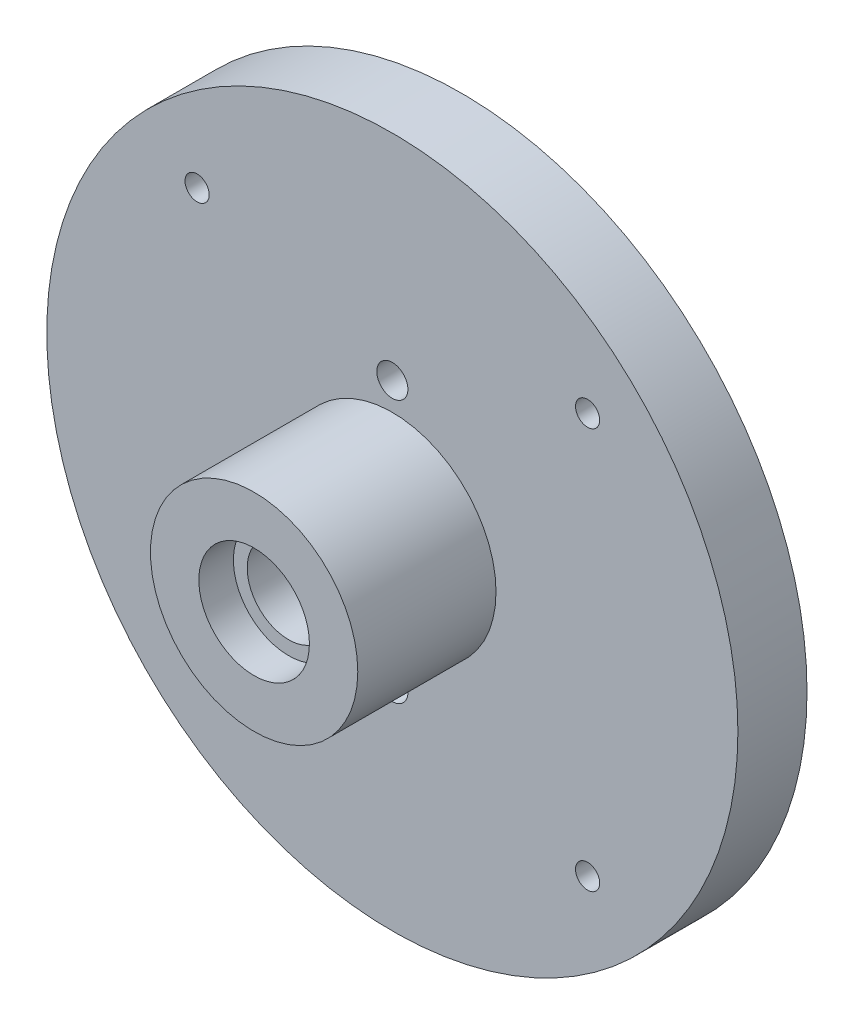
ISO-10303-21;
HEADER;
FILE_DESCRIPTION(('STEP AP214'),'2;1');
FILE_NAME('part.step','',(''),(''),'','','');
FILE_SCHEMA(('AUTOMOTIVE_DESIGN { 1 0 10303 214 1 1 1 1 }'));
ENDSEC;
DATA;
#1=APPLICATION_CONTEXT('core data for automotive mechanical design processes');
#2=APPLICATION_PROTOCOL_DEFINITION('international standard','automotive_design',2000,#1);
#3=PRODUCT_CONTEXT('',#1,'mechanical');
#4=PRODUCT('Part','Part','',(#3));
#5=PRODUCT_RELATED_PRODUCT_CATEGORY('part','',(#4));
#6=PRODUCT_DEFINITION_FORMATION('','',#4);
#7=PRODUCT_DEFINITION_CONTEXT('part definition',#1,'design');
#8=PRODUCT_DEFINITION('design','',#6,#7);
#9=PRODUCT_DEFINITION_SHAPE('','',#8);
#10=(LENGTH_UNIT() NAMED_UNIT(*) SI_UNIT(.MILLI.,.METRE.));
#11=(NAMED_UNIT(*) PLANE_ANGLE_UNIT() SI_UNIT($,.RADIAN.));
#12=(NAMED_UNIT(*) SI_UNIT($,.STERADIAN.) SOLID_ANGLE_UNIT());
#13=UNCERTAINTY_MEASURE_WITH_UNIT(LENGTH_MEASURE(1.E-05),#10,'distance_accuracy_value','');
#14=(GEOMETRIC_REPRESENTATION_CONTEXT(3) GLOBAL_UNCERTAINTY_ASSIGNED_CONTEXT((#13)) GLOBAL_UNIT_ASSIGNED_CONTEXT((#10,
#11,#12)) REPRESENTATION_CONTEXT('',''));
#15=CARTESIAN_POINT('',(0.,0.,0.));
#16=DIRECTION('',(0.,0.,1.));
#17=DIRECTION('',(1.,0.,0.));
#18=AXIS2_PLACEMENT_3D('',#15,#16,#17);
#19=CARTESIAN_POINT('',(0.,0.,10.));
#20=DIRECTION('',(0.,0.,1.));
#21=DIRECTION('',(1.,0.,0.));
#22=AXIS2_PLACEMENT_3D('',#19,#20,#21);
#23=PLANE('',#22);
#24=CARTESIAN_POINT('',(0.,-19.,10.));
#25=DIRECTION('',(0.,0.,1.));
#26=DIRECTION('',(1.,0.,0.));
#27=AXIS2_PLACEMENT_3D('',#24,#25,#26);
#28=CIRCLE('',#27,2.25);
#29=CARTESIAN_POINT('',(2.25,-19.,10.));
#30=VERTEX_POINT('',#29);
#31=EDGE_CURVE('E90',#30,#30,#28,.T.);
#32=ORIENTED_EDGE('',*,*,#31,.F.);
#33=EDGE_LOOP('',(#32));
#34=FACE_BOUND('',#33,.T.);
#35=CARTESIAN_POINT('',(0.,19.,10.));
#36=DIRECTION('',(0.,0.,1.));
#37=DIRECTION('',(1.,0.,0.));
#38=AXIS2_PLACEMENT_3D('',#35,#36,#37);
#39=CIRCLE('',#38,2.25);
#40=CARTESIAN_POINT('',(2.25,19.,10.));
#41=VERTEX_POINT('',#40);
#42=EDGE_CURVE('E84',#41,#41,#39,.T.);
#43=ORIENTED_EDGE('',*,*,#42,.F.);
#44=EDGE_LOOP('',(#43));
#45=FACE_BOUND('',#44,.T.);
#46=CARTESIAN_POINT('',(28.25,-29.,10.));
#47=DIRECTION('',(0.,0.,1.));
#48=DIRECTION('',(1.,0.,0.));
#49=AXIS2_PLACEMENT_3D('',#46,#47,#48);
#50=CIRCLE('',#49,1.75);
#51=CARTESIAN_POINT('',(30.,-29.,10.));
#52=VERTEX_POINT('',#51);
#53=EDGE_CURVE('E78',#52,#52,#50,.T.);
#54=ORIENTED_EDGE('',*,*,#53,.F.);
#55=EDGE_LOOP('',(#54));
#56=FACE_BOUND('',#55,.T.);
#57=CARTESIAN_POINT('',(-28.25,-29.,10.));
#58=DIRECTION('',(0.,0.,1.));
#59=DIRECTION('',(1.,0.,0.));
#60=AXIS2_PLACEMENT_3D('',#57,#58,#59);
#61=CIRCLE('',#60,1.75);
#62=CARTESIAN_POINT('',(-26.5,-29.,10.));
#63=VERTEX_POINT('',#62);
#64=EDGE_CURVE('E72',#63,#63,#61,.T.);
#65=ORIENTED_EDGE('',*,*,#64,.F.);
#66=EDGE_LOOP('',(#65));
#67=FACE_BOUND('',#66,.T.);
#68=CARTESIAN_POINT('',(-28.25,29.,10.));
#69=DIRECTION('',(0.,0.,1.));
#70=DIRECTION('',(1.,0.,0.));
#71=AXIS2_PLACEMENT_3D('',#68,#69,#70);
#72=CIRCLE('',#71,1.75);
#73=CARTESIAN_POINT('',(-26.5,29.,10.));
#74=VERTEX_POINT('',#73);
#75=EDGE_CURVE('E66',#74,#74,#72,.T.);
#76=ORIENTED_EDGE('',*,*,#75,.F.);
#77=EDGE_LOOP('',(#76));
#78=FACE_BOUND('',#77,.T.);
#79=CARTESIAN_POINT('',(28.25,29.,10.));
#80=DIRECTION('',(0.,0.,1.));
#81=DIRECTION('',(1.,0.,0.));
#82=AXIS2_PLACEMENT_3D('',#79,#80,#81);
#83=CIRCLE('',#82,1.75);
#84=CARTESIAN_POINT('',(30.,29.,10.));
#85=VERTEX_POINT('',#84);
#86=EDGE_CURVE('E58',#85,#85,#83,.T.);
#87=ORIENTED_EDGE('',*,*,#86,.F.);
#88=EDGE_LOOP('',(#87));
#89=FACE_BOUND('',#88,.T.);
#90=CARTESIAN_POINT('',(0.,0.,10.));
#91=DIRECTION('',(0.,0.,1.));
#92=DIRECTION('',(1.,0.,0.));
#93=AXIS2_PLACEMENT_3D('',#90,#91,#92);
#94=CIRCLE('',#93,50.);
#95=CARTESIAN_POINT('',(50.,0.,10.));
#96=VERTEX_POINT('',#95);
#97=EDGE_CURVE('E10',#96,#96,#94,.T.);
#98=ORIENTED_EDGE('',*,*,#97,.T.);
#99=EDGE_LOOP('',(#98));
#100=FACE_BOUND('',#99,.T.);
#101=CARTESIAN_POINT('',(0.,0.,10.));
#102=DIRECTION('',(0.,0.,1.));
#103=DIRECTION('',(1.,0.,0.));
#104=AXIS2_PLACEMENT_3D('',#101,#102,#103);
#105=CIRCLE('',#104,15.);
#106=CARTESIAN_POINT('',(15.,0.,10.));
#107=VERTEX_POINT('',#106);
#108=EDGE_CURVE('E43',#107,#107,#105,.T.);
#109=ORIENTED_EDGE('',*,*,#108,.F.);
#110=EDGE_LOOP('',(#109));
#111=FACE_BOUND('',#110,.T.);
#112=ADVANCED_FACE('F30',(#34,#45,#56,#67,#78,#89,#100,#111),#23,.T.);
#113=CARTESIAN_POINT('',(0.,0.,10.));
#114=DIRECTION('',(0.,0.,-1.));
#115=DIRECTION('',(-1.,0.,0.));
#116=AXIS2_PLACEMENT_3D('',#113,#114,#115);
#117=CYLINDRICAL_SURFACE('',#116,50.);
#118=ORIENTED_EDGE('',*,*,#97,.F.);
#119=EDGE_LOOP('',(#118));
#120=FACE_BOUND('',#119,.T.);
#121=CARTESIAN_POINT('',(0.,0.,0.));
#122=DIRECTION('',(0.,0.,1.));
#123=DIRECTION('',(1.,0.,0.));
#124=AXIS2_PLACEMENT_3D('',#121,#122,#123);
#125=CIRCLE('',#124,50.);
#126=CARTESIAN_POINT('',(50.,0.,0.));
#127=VERTEX_POINT('',#126);
#128=EDGE_CURVE('E34',#127,#127,#125,.T.);
#129=ORIENTED_EDGE('',*,*,#128,.T.);
#130=EDGE_LOOP('',(#129));
#131=FACE_BOUND('',#130,.T.);
#132=ADVANCED_FACE('F32',(#120,#131),#117,.T.);
#133=CARTESIAN_POINT('',(0.,0.,0.));
#134=DIRECTION('',(0.,0.,1.));
#135=DIRECTION('',(1.,0.,0.));
#136=AXIS2_PLACEMENT_3D('',#133,#134,#135);
#137=PLANE('',#136);
#138=CARTESIAN_POINT('',(0.,-19.,0.));
#139=DIRECTION('',(0.,0.,-1.));
#140=DIRECTION('',(1.,0.,0.));
#141=AXIS2_PLACEMENT_3D('',#138,#139,#140);
#142=CIRCLE('',#141,2.25);
#143=CARTESIAN_POINT('',(2.25,-19.,0.));
#144=VERTEX_POINT('',#143);
#145=EDGE_CURVE('E93',#144,#144,#142,.T.);
#146=ORIENTED_EDGE('',*,*,#145,.F.);
#147=EDGE_LOOP('',(#146));
#148=FACE_BOUND('',#147,.T.);
#149=CARTESIAN_POINT('',(0.,19.,0.));
#150=DIRECTION('',(0.,0.,-1.));
#151=DIRECTION('',(-1.,0.,0.));
#152=AXIS2_PLACEMENT_3D('',#149,#150,#151);
#153=CIRCLE('',#152,2.25);
#154=CARTESIAN_POINT('',(-2.25,19.,0.));
#155=VERTEX_POINT('',#154);
#156=EDGE_CURVE('E87',#155,#155,#153,.T.);
#157=ORIENTED_EDGE('',*,*,#156,.F.);
#158=EDGE_LOOP('',(#157));
#159=FACE_BOUND('',#158,.T.);
#160=CARTESIAN_POINT('',(28.25,-29.,0.));
#161=DIRECTION('',(0.,0.,-1.));
#162=DIRECTION('',(1.,0.,0.));
#163=AXIS2_PLACEMENT_3D('',#160,#161,#162);
#164=CIRCLE('',#163,1.75);
#165=CARTESIAN_POINT('',(30.,-29.,0.));
#166=VERTEX_POINT('',#165);
#167=EDGE_CURVE('E81',#166,#166,#164,.T.);
#168=ORIENTED_EDGE('',*,*,#167,.F.);
#169=EDGE_LOOP('',(#168));
#170=FACE_BOUND('',#169,.T.);
#171=CARTESIAN_POINT('',(-28.25,-29.,0.));
#172=DIRECTION('',(0.,0.,-1.));
#173=DIRECTION('',(-1.,0.,0.));
#174=AXIS2_PLACEMENT_3D('',#171,#172,#173);
#175=CIRCLE('',#174,1.75);
#176=CARTESIAN_POINT('',(-30.,-29.,0.));
#177=VERTEX_POINT('',#176);
#178=EDGE_CURVE('E75',#177,#177,#175,.T.);
#179=ORIENTED_EDGE('',*,*,#178,.F.);
#180=EDGE_LOOP('',(#179));
#181=FACE_BOUND('',#180,.T.);
#182=CARTESIAN_POINT('',(-28.25,29.,0.));
#183=DIRECTION('',(0.,0.,-1.));
#184=DIRECTION('',(1.,0.,0.));
#185=AXIS2_PLACEMENT_3D('',#182,#183,#184);
#186=CIRCLE('',#185,1.75);
#187=CARTESIAN_POINT('',(-26.5,29.,0.));
#188=VERTEX_POINT('',#187);
#189=EDGE_CURVE('E69',#188,#188,#186,.T.);
#190=ORIENTED_EDGE('',*,*,#189,.F.);
#191=EDGE_LOOP('',(#190));
#192=FACE_BOUND('',#191,.T.);
#193=CARTESIAN_POINT('',(28.25,29.,0.));
#194=DIRECTION('',(0.,0.,-1.));
#195=DIRECTION('',(-1.,0.,0.));
#196=AXIS2_PLACEMENT_3D('',#193,#194,#195);
#197=CIRCLE('',#196,1.75);
#198=CARTESIAN_POINT('',(26.5,29.,0.));
#199=VERTEX_POINT('',#198);
#200=EDGE_CURVE('E63',#199,#199,#197,.T.);
#201=ORIENTED_EDGE('',*,*,#200,.F.);
#202=EDGE_LOOP('',(#201));
#203=FACE_BOUND('',#202,.T.);
#204=CARTESIAN_POINT('',(0.,0.,0.));
#205=DIRECTION('',(0.,0.,1.));
#206=DIRECTION('',(1.,0.,0.));
#207=AXIS2_PLACEMENT_3D('',#204,#205,#206);
#208=CIRCLE('',#207,6.);
#209=CARTESIAN_POINT('',(6.,0.,0.));
#210=VERTEX_POINT('',#209);
#211=EDGE_CURVE('E52',#210,#210,#208,.T.);
#212=ORIENTED_EDGE('',*,*,#211,.T.);
#213=EDGE_LOOP('',(#212));
#214=FACE_BOUND('',#213,.T.);
#215=ORIENTED_EDGE('',*,*,#128,.F.);
#216=EDGE_LOOP('',(#215));
#217=FACE_BOUND('',#216,.T.);
#218=ADVANCED_FACE('F99',(#148,#159,#170,#181,#192,#203,#214,#217),#137,.F.);
#219=CARTESIAN_POINT('',(0.,0.,30.));
#220=DIRECTION('',(0.,0.,-1.));
#221=DIRECTION('',(-1.,0.,0.));
#222=AXIS2_PLACEMENT_3D('',#219,#220,#221);
#223=CYLINDRICAL_SURFACE('',#222,15.);
#224=CARTESIAN_POINT('',(0.,0.,30.));
#225=DIRECTION('',(0.,0.,1.));
#226=DIRECTION('',(1.,0.,0.));
#227=AXIS2_PLACEMENT_3D('',#224,#225,#226);
#228=CIRCLE('',#227,15.);
#229=CARTESIAN_POINT('',(15.,0.,30.));
#230=VERTEX_POINT('',#229);
#231=EDGE_CURVE('E41',#230,#230,#228,.T.);
#232=ORIENTED_EDGE('',*,*,#231,.F.);
#233=EDGE_LOOP('',(#232));
#234=FACE_BOUND('',#233,.T.);
#235=ORIENTED_EDGE('',*,*,#108,.T.);
#236=EDGE_LOOP('',(#235));
#237=FACE_BOUND('',#236,.T.);
#238=ADVANCED_FACE('F102',(#234,#237),#223,.T.);
#239=CARTESIAN_POINT('',(0.,0.,30.));
#240=DIRECTION('',(0.,0.,1.));
#241=DIRECTION('',(1.,0.,0.));
#242=AXIS2_PLACEMENT_3D('',#239,#240,#241);
#243=PLANE('',#242);
#244=CARTESIAN_POINT('',(0.,0.,30.));
#245=DIRECTION('',(0.,0.,1.));
#246=DIRECTION('',(1.,0.,0.));
#247=AXIS2_PLACEMENT_3D('',#244,#245,#246);
#248=CIRCLE('',#247,8.);
#249=CARTESIAN_POINT('',(8.,0.,30.));
#250=VERTEX_POINT('',#249);
#251=EDGE_CURVE('E49',#250,#250,#248,.T.);
#252=ORIENTED_EDGE('',*,*,#251,.F.);
#253=EDGE_LOOP('',(#252));
#254=FACE_BOUND('',#253,.T.);
#255=ORIENTED_EDGE('',*,*,#231,.T.);
#256=EDGE_LOOP('',(#255));
#257=FACE_BOUND('',#256,.T.);
#258=ADVANCED_FACE('F131',(#254,#257),#243,.T.);
#259=CARTESIAN_POINT('',(0.,0.,25.));
#260=DIRECTION('',(0.,0.,1.));
#261=DIRECTION('',(1.,0.,0.));
#262=AXIS2_PLACEMENT_3D('',#259,#260,#261);
#263=CYLINDRICAL_SURFACE('',#262,8.);
#264=CARTESIAN_POINT('',(0.,0.,25.));
#265=DIRECTION('',(0.,0.,1.));
#266=DIRECTION('',(1.,0.,0.));
#267=AXIS2_PLACEMENT_3D('',#264,#265,#266);
#268=CIRCLE('',#267,8.);
#269=CARTESIAN_POINT('',(8.,0.,25.));
#270=VERTEX_POINT('',#269);
#271=EDGE_CURVE('E46',#270,#270,#268,.T.);
#272=ORIENTED_EDGE('',*,*,#271,.F.);
#273=EDGE_LOOP('',(#272));
#274=FACE_BOUND('',#273,.T.);
#275=ORIENTED_EDGE('',*,*,#251,.T.);
#276=EDGE_LOOP('',(#275));
#277=FACE_BOUND('',#276,.T.);
#278=ADVANCED_FACE('F135',(#274,#277),#263,.F.);
#279=CARTESIAN_POINT('',(0.,0.,25.));
#280=DIRECTION('',(0.,0.,1.));
#281=DIRECTION('',(1.,0.,0.));
#282=AXIS2_PLACEMENT_3D('',#279,#280,#281);
#283=PLANE('',#282);
#284=CARTESIAN_POINT('',(0.,0.,25.));
#285=DIRECTION('',(0.,0.,1.));
#286=DIRECTION('',(1.,0.,0.));
#287=AXIS2_PLACEMENT_3D('',#284,#285,#286);
#288=CIRCLE('',#287,6.);
#289=CARTESIAN_POINT('',(6.,0.,25.));
#290=VERTEX_POINT('',#289);
#291=EDGE_CURVE('E55',#290,#290,#288,.T.);
#292=ORIENTED_EDGE('',*,*,#291,.F.);
#293=EDGE_LOOP('',(#292));
#294=FACE_BOUND('',#293,.T.);
#295=ORIENTED_EDGE('',*,*,#271,.T.);
#296=EDGE_LOOP('',(#295));
#297=FACE_BOUND('',#296,.T.);
#298=ADVANCED_FACE('F139',(#294,#297),#283,.T.);
#299=CARTESIAN_POINT('',(0.,0.,0.));
#300=DIRECTION('',(0.,0.,1.));
#301=DIRECTION('',(1.,0.,0.));
#302=AXIS2_PLACEMENT_3D('',#299,#300,#301);
#303=CYLINDRICAL_SURFACE('',#302,6.);
#304=CARTESIAN_POINT('',(6.,0.,0.));
#305=CARTESIAN_POINT('',(6.,0.,0.260416666666666));
#306=CARTESIAN_POINT('',(6.,0.,0.520833333333333));
#307=CARTESIAN_POINT('',(6.,0.,1.04166666666667));
#308=CARTESIAN_POINT('',(6.,0.,1.30208333333333));
#309=CARTESIAN_POINT('',(6.,0.,1.82291666666667));
#310=CARTESIAN_POINT('',(6.,0.,2.08333333333333));
#311=CARTESIAN_POINT('',(6.,0.,2.60416666666667));
#312=CARTESIAN_POINT('',(6.,0.,2.86458333333333));
#313=CARTESIAN_POINT('',(6.,0.,3.38541666666667));
#314=CARTESIAN_POINT('',(6.,0.,3.64583333333333));
#315=CARTESIAN_POINT('',(6.,0.,4.16666666666667));
#316=CARTESIAN_POINT('',(6.,0.,4.42708333333333));
#317=CARTESIAN_POINT('',(6.,0.,4.94791666666667));
#318=CARTESIAN_POINT('',(6.,0.,5.20833333333333));
#319=CARTESIAN_POINT('',(6.,0.,5.72916666666667));
#320=CARTESIAN_POINT('',(6.,0.,5.98958333333333));
#321=CARTESIAN_POINT('',(6.,0.,6.51041666666667));
#322=CARTESIAN_POINT('',(6.,0.,6.77083333333333));
#323=CARTESIAN_POINT('',(6.,0.,7.29166666666667));
#324=CARTESIAN_POINT('',(6.,0.,7.55208333333333));
#325=CARTESIAN_POINT('',(6.,0.,8.07291666666667));
#326=CARTESIAN_POINT('',(6.,0.,8.33333333333333));
#327=CARTESIAN_POINT('',(6.,0.,8.85416666666667));
#328=CARTESIAN_POINT('',(6.,0.,9.11458333333333));
#329=CARTESIAN_POINT('',(6.,0.,9.63541666666667));
#330=CARTESIAN_POINT('',(6.,0.,9.89583333333333));
#331=CARTESIAN_POINT('',(6.,0.,10.4166666666667));
#332=CARTESIAN_POINT('',(6.,0.,10.6770833333333));
#333=CARTESIAN_POINT('',(6.,0.,11.1979166666667));
#334=CARTESIAN_POINT('',(6.,0.,11.4583333333333));
#335=CARTESIAN_POINT('',(6.,0.,11.9791666666667));
#336=CARTESIAN_POINT('',(6.,0.,12.2395833333333));
#337=CARTESIAN_POINT('',(6.,0.,12.7604166666667));
#338=CARTESIAN_POINT('',(6.,0.,13.0208333333333));
#339=CARTESIAN_POINT('',(6.,0.,13.5416666666667));
#340=CARTESIAN_POINT('',(6.,0.,13.8020833333333));
#341=CARTESIAN_POINT('',(6.,0.,14.3229166666667));
#342=CARTESIAN_POINT('',(6.,0.,14.5833333333333));
#343=CARTESIAN_POINT('',(6.,0.,15.1041666666667));
#344=CARTESIAN_POINT('',(6.,0.,15.3645833333333));
#345=CARTESIAN_POINT('',(6.,0.,15.8854166666667));
#346=CARTESIAN_POINT('',(6.,0.,16.1458333333333));
#347=CARTESIAN_POINT('',(6.,0.,16.6666666666667));
#348=CARTESIAN_POINT('',(6.,0.,16.9270833333333));
#349=CARTESIAN_POINT('',(6.,0.,17.4479166666667));
#350=CARTESIAN_POINT('',(6.,0.,17.7083333333333));
#351=CARTESIAN_POINT('',(6.,0.,18.2291666666667));
#352=CARTESIAN_POINT('',(6.,0.,18.4895833333333));
#353=CARTESIAN_POINT('',(6.,0.,19.0104166666667));
#354=CARTESIAN_POINT('',(6.,0.,19.2708333333333));
#355=CARTESIAN_POINT('',(6.,0.,19.7916666666667));
#356=CARTESIAN_POINT('',(6.,0.,20.0520833333333));
#357=CARTESIAN_POINT('',(6.,0.,20.5729166666667));
#358=CARTESIAN_POINT('',(6.,0.,20.8333333333333));
#359=CARTESIAN_POINT('',(6.,0.,21.3541666666667));
#360=CARTESIAN_POINT('',(6.,0.,21.6145833333333));
#361=CARTESIAN_POINT('',(6.,0.,22.1354166666667));
#362=CARTESIAN_POINT('',(6.,0.,22.3958333333333));
#363=CARTESIAN_POINT('',(6.,0.,22.9166666666667));
#364=CARTESIAN_POINT('',(6.,0.,23.1770833333333));
#365=CARTESIAN_POINT('',(6.,0.,23.6979166666667));
#366=CARTESIAN_POINT('',(6.,0.,23.9583333333333));
#367=CARTESIAN_POINT('',(6.,0.,24.4791666666667));
#368=CARTESIAN_POINT('',(6.,0.,24.7395833333333));
#369=CARTESIAN_POINT('',(6.,0.,25.));
#370=B_SPLINE_CURVE_WITH_KNOTS('',3,(#304,#305,#306,#307,#308,#309,#310,#311,#312,#313,#314,
#315,#316,#317,#318,#319,#320,#321,#322,#323,#324,#325,#326,#327,#328,#329,#330,#331,#332,#333,
#334,#335,#336,#337,#338,#339,#340,#341,#342,#343,#344,#345,#346,#347,#348,#349,#350,#351,#352,
#353,#354,#355,#356,#357,#358,#359,#360,#361,#362,#363,#364,#365,#366,#367,#368,#369),
.UNSPECIFIED.,.F.,.F.,(4,2,2,2,2,2,2,2,2,2,2,2,2,2,2,2,2,2,2,2,2,2,2,2,2,2,2,2,2,2,2,2,4),(0.,
0.78125,1.5625,2.34375,3.125,3.90625,4.6875,5.46875,6.25,7.03125,7.8125,8.59375,9.375,10.15625,
10.9375,11.71875,12.5,13.28125,14.0625,14.84375,15.625,16.40625,17.1875,17.96875,18.75,19.53125,
20.3125,21.09375,21.875,22.65625,23.4375,24.21875,25.),.UNSPECIFIED.);
#371=EDGE_CURVE('BSEAM143',#210,#290,#370,.T.);
#372=ORIENTED_EDGE('',*,*,#211,.F.);
#373=ORIENTED_EDGE('',*,*,#291,.T.);
#374=ORIENTED_EDGE('',*,*,#371,.T.);
#375=ORIENTED_EDGE('',*,*,#371,.F.);
#376=EDGE_LOOP('',(#372,#374,#373,#375));
#377=FACE_BOUND('',#376,.T.);
#378=ADVANCED_FACE('F143',(#377),#303,.F.);
#379=CARTESIAN_POINT('',(28.25,29.,30.));
#380=DIRECTION('',(0.,0.,-1.));
#381=DIRECTION('',(-1.,0.,0.));
#382=AXIS2_PLACEMENT_3D('',#379,#380,#381);
#383=CYLINDRICAL_SURFACE('',#382,1.75);
#384=ORIENTED_EDGE('',*,*,#86,.T.);
#385=EDGE_LOOP('',(#384));
#386=FACE_BOUND('',#385,.T.);
#387=ORIENTED_EDGE('',*,*,#200,.T.);
#388=EDGE_LOOP('',(#387));
#389=FACE_BOUND('',#388,.T.);
#390=ADVANCED_FACE('F147',(#386,#389),#383,.F.);
#391=CARTESIAN_POINT('',(-28.25,29.,30.));
#392=DIRECTION('',(0.,0.,-1.));
#393=DIRECTION('',(-1.,0.,0.));
#394=AXIS2_PLACEMENT_3D('',#391,#392,#393);
#395=CYLINDRICAL_SURFACE('',#394,1.75);
#396=ORIENTED_EDGE('',*,*,#75,.T.);
#397=EDGE_LOOP('',(#396));
#398=FACE_BOUND('',#397,.T.);
#399=ORIENTED_EDGE('',*,*,#189,.T.);
#400=EDGE_LOOP('',(#399));
#401=FACE_BOUND('',#400,.T.);
#402=ADVANCED_FACE('F151',(#398,#401),#395,.F.);
#403=CARTESIAN_POINT('',(-28.25,-29.,30.));
#404=DIRECTION('',(0.,0.,-1.));
#405=DIRECTION('',(-1.,0.,0.));
#406=AXIS2_PLACEMENT_3D('',#403,#404,#405);
#407=CYLINDRICAL_SURFACE('',#406,1.75);
#408=ORIENTED_EDGE('',*,*,#64,.T.);
#409=EDGE_LOOP('',(#408));
#410=FACE_BOUND('',#409,.T.);
#411=ORIENTED_EDGE('',*,*,#178,.T.);
#412=EDGE_LOOP('',(#411));
#413=FACE_BOUND('',#412,.T.);
#414=ADVANCED_FACE('F155',(#410,#413),#407,.F.);
#415=CARTESIAN_POINT('',(28.25,-29.,30.));
#416=DIRECTION('',(0.,0.,-1.));
#417=DIRECTION('',(-1.,0.,0.));
#418=AXIS2_PLACEMENT_3D('',#415,#416,#417);
#419=CYLINDRICAL_SURFACE('',#418,1.75);
#420=ORIENTED_EDGE('',*,*,#53,.T.);
#421=EDGE_LOOP('',(#420));
#422=FACE_BOUND('',#421,.T.);
#423=ORIENTED_EDGE('',*,*,#167,.T.);
#424=EDGE_LOOP('',(#423));
#425=FACE_BOUND('',#424,.T.);
#426=ADVANCED_FACE('F159',(#422,#425),#419,.F.);
#427=CARTESIAN_POINT('',(0.,19.,30.));
#428=DIRECTION('',(0.,0.,-1.));
#429=DIRECTION('',(-1.,0.,0.));
#430=AXIS2_PLACEMENT_3D('',#427,#428,#429);
#431=CYLINDRICAL_SURFACE('',#430,2.25);
#432=ORIENTED_EDGE('',*,*,#42,.T.);
#433=EDGE_LOOP('',(#432));
#434=FACE_BOUND('',#433,.T.);
#435=ORIENTED_EDGE('',*,*,#156,.T.);
#436=EDGE_LOOP('',(#435));
#437=FACE_BOUND('',#436,.T.);
#438=ADVANCED_FACE('F163',(#434,#437),#431,.F.);
#439=CARTESIAN_POINT('',(0.,-19.,30.));
#440=DIRECTION('',(0.,0.,-1.));
#441=DIRECTION('',(-1.,0.,0.));
#442=AXIS2_PLACEMENT_3D('',#439,#440,#441);
#443=CYLINDRICAL_SURFACE('',#442,2.25);
#444=ORIENTED_EDGE('',*,*,#31,.T.);
#445=EDGE_LOOP('',(#444));
#446=FACE_BOUND('',#445,.T.);
#447=ORIENTED_EDGE('',*,*,#145,.T.);
#448=EDGE_LOOP('',(#447));
#449=FACE_BOUND('',#448,.T.);
#450=ADVANCED_FACE('F97',(#446,#449),#443,.F.);
#451=CLOSED_SHELL('',(#112,#132,#218,#238,#258,#278,#298,#378,#390,#402,#414,#426,#438,#450));
#452=MANIFOLD_SOLID_BREP('B2',#451);
#453=ADVANCED_BREP_SHAPE_REPRESENTATION('',(#18,#452),#14);
#454=SHAPE_DEFINITION_REPRESENTATION(#9,#453);
ENDSEC;
END-ISO-10303-21;
